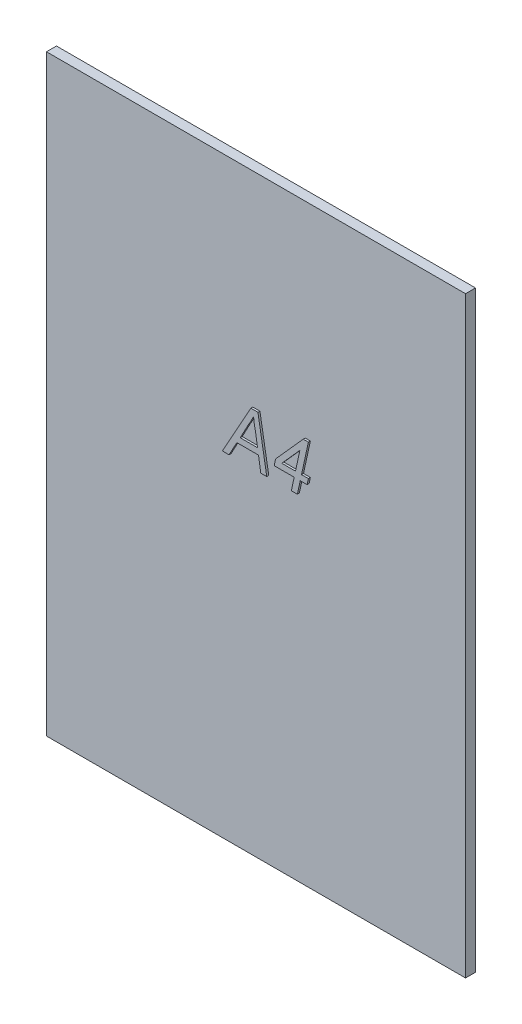
ISO-10303-21;
HEADER;
FILE_DESCRIPTION(('STEP AP214'),'2;1');
FILE_NAME('part.step','',(''),(''),'','','');
FILE_SCHEMA(('AUTOMOTIVE_DESIGN { 1 0 10303 214 1 1 1 1 }'));
ENDSEC;
DATA;
#1=APPLICATION_CONTEXT('core data for automotive mechanical design processes');
#2=APPLICATION_PROTOCOL_DEFINITION('international standard','automotive_design',2000,#1);
#3=PRODUCT_CONTEXT('',#1,'mechanical');
#4=PRODUCT('Part','Part','',(#3));
#5=PRODUCT_RELATED_PRODUCT_CATEGORY('part','',(#4));
#6=PRODUCT_DEFINITION_FORMATION('','',#4);
#7=PRODUCT_DEFINITION_CONTEXT('part definition',#1,'design');
#8=PRODUCT_DEFINITION('design','',#6,#7);
#9=PRODUCT_DEFINITION_SHAPE('','',#8);
#10=(LENGTH_UNIT() NAMED_UNIT(*) SI_UNIT(.MILLI.,.METRE.));
#11=(NAMED_UNIT(*) PLANE_ANGLE_UNIT() SI_UNIT($,.RADIAN.));
#12=(NAMED_UNIT(*) SI_UNIT($,.STERADIAN.) SOLID_ANGLE_UNIT());
#13=UNCERTAINTY_MEASURE_WITH_UNIT(LENGTH_MEASURE(1.E-05),#10,'distance_accuracy_value','');
#14=(GEOMETRIC_REPRESENTATION_CONTEXT(3) GLOBAL_UNCERTAINTY_ASSIGNED_CONTEXT((#13)) GLOBAL_UNIT_ASSIGNED_CONTEXT((#10,
#11,#12)) REPRESENTATION_CONTEXT('',''));
#15=CARTESIAN_POINT('',(0.,0.,0.));
#16=DIRECTION('',(0.,0.,1.));
#17=DIRECTION('',(1.,0.,0.));
#18=AXIS2_PLACEMENT_3D('',#15,#16,#17);
#19=CARTESIAN_POINT('',(0.,0.,3.5));
#20=DIRECTION('',(0.,0.,-1.));
#21=DIRECTION('',(-1.,0.,0.));
#22=AXIS2_PLACEMENT_3D('',#19,#20,#21);
#23=PLANE('',#22);
#24=DIRECTION('',(-1.,0.,0.));
#25=VECTOR('',#24,1.);
#26=CARTESIAN_POINT('',(21.7241162808252,20.3217621400878,3.5));
#27=LINE('',#26,#25);
#28=CARTESIAN_POINT('',(21.7241162808252,20.3217621400878,3.5));
#29=VERTEX_POINT('',#28);
#30=CARTESIAN_POINT('',(18.704078083642,20.3217621400878,3.5));
#31=VERTEX_POINT('',#30);
#32=EDGE_CURVE('E175',#29,#31,#27,.T.);
#33=ORIENTED_EDGE('',*,*,#32,.F.);
#34=DIRECTION('',(-0.212968350352364,-0.977059098390774,0.));
#35=VECTOR('',#34,1.);
#36=CARTESIAN_POINT('',(23.1595347765903,26.9071946654617,3.5));
#37=LINE('',#36,#35);
#38=CARTESIAN_POINT('',(23.1595347765903,26.9071946654617,3.5));
#39=VERTEX_POINT('',#38);
#40=EDGE_CURVE('E206',#39,#29,#37,.T.);
#41=ORIENTED_EDGE('',*,*,#40,.F.);
#42=DIRECTION('',(-1.,0.,0.));
#43=VECTOR('',#42,1.);
#44=CARTESIAN_POINT('',(26.6065971140907,26.9071946654617,3.5));
#45=LINE('',#44,#43);
#46=CARTESIAN_POINT('',(26.6065971140907,26.9071946654617,3.5));
#47=VERTEX_POINT('',#46);
#48=EDGE_CURVE('E203',#47,#39,#45,.T.);
#49=ORIENTED_EDGE('',*,*,#48,.F.);
#50=DIRECTION('',(-0.216930457818656,-0.976187060183953,0.));
#51=VECTOR('',#50,1.);
#52=CARTESIAN_POINT('',(27.2651403666281,29.87063930188,3.5));
#53=LINE('',#52,#51);
#54=CARTESIAN_POINT('',(27.2651403666281,29.87063930188,3.5));
#55=VERTEX_POINT('',#54);
#56=EDGE_CURVE('E200',#55,#47,#53,.T.);
#57=ORIENTED_EDGE('',*,*,#56,.F.);
#58=DIRECTION('',(1.,0.,0.));
#59=VECTOR('',#58,1.);
#60=CARTESIAN_POINT('',(23.8026434216464,29.87063930188,3.5));
#61=LINE('',#60,#59);
#62=CARTESIAN_POINT('',(23.8026434216464,29.87063930188,3.5));
#63=VERTEX_POINT('',#62);
#64=EDGE_CURVE('E197',#63,#55,#61,.T.);
#65=ORIENTED_EDGE('',*,*,#64,.F.);
#66=DIRECTION('',(-0.212786162671667,-0.977098791819674,0.));
#67=VECTOR('',#66,1.);
#68=CARTESIAN_POINT('',(27.2445608899863,45.6756773627774,3.5));
#69=LINE('',#68,#67);
#70=CARTESIAN_POINT('',(27.2445608899863,45.6756773627774,3.5));
#71=VERTEX_POINT('',#70);
#72=EDGE_CURVE('E194',#71,#63,#69,.T.);
#73=ORIENTED_EDGE('',*,*,#72,.F.);
#74=DIRECTION('',(1.,0.,0.));
#75=VECTOR('',#74,1.);
#76=CARTESIAN_POINT('',(24.6309673564786,45.6756773627774,3.5));
#77=LINE('',#76,#75);
#78=CARTESIAN_POINT('',(24.6309673564786,45.6756773627774,3.5));
#79=VERTEX_POINT('',#78);
#80=EDGE_CURVE('E191',#79,#71,#77,.T.);
#81=ORIENTED_EDGE('',*,*,#80,.F.);
#82=DIRECTION('',(0.666084707098258,0.745876104302737,0.));
#83=VECTOR('',#82,1.);
#84=CARTESIAN_POINT('',(10.8015590531933,30.1896211898278,3.5));
#85=LINE('',#84,#83);
#86=CARTESIAN_POINT('',(10.8015590531933,30.1896211898278,3.5));
#87=VERTEX_POINT('',#86);
#88=EDGE_CURVE('E188',#87,#79,#85,.T.);
#89=ORIENTED_EDGE('',*,*,#88,.F.);
#90=DIRECTION('',(0.196707166717952,0.980462284109795,0.));
#91=VECTOR('',#90,1.);
#92=CARTESIAN_POINT('',(10.1430158006559,26.9071946654617,3.5));
#93=LINE('',#92,#91);
#94=CARTESIAN_POINT('',(10.1430158006559,26.9071946654617,3.5));
#95=VERTEX_POINT('',#94);
#96=EDGE_CURVE('E185',#95,#87,#93,.T.);
#97=ORIENTED_EDGE('',*,*,#96,.F.);
#98=DIRECTION('',(-1.,0.,0.));
#99=VECTOR('',#98,1.);
#100=CARTESIAN_POINT('',(20.1394965794071,26.9071946654617,3.5));
#101=LINE('',#100,#99);
#102=CARTESIAN_POINT('',(20.1394965794071,26.9071946654617,3.5));
#103=VERTEX_POINT('',#102);
#104=EDGE_CURVE('E182',#103,#95,#101,.T.);
#105=ORIENTED_EDGE('',*,*,#104,.F.);
#106=DIRECTION('',(0.212968350352364,0.977059098390774,0.));
#107=VECTOR('',#106,1.);
#108=CARTESIAN_POINT('',(18.704078083642,20.3217621400878,3.5));
#109=LINE('',#108,#107);
#110=EDGE_CURVE('E178',#31,#103,#109,.T.);
#111=ORIENTED_EDGE('',*,*,#110,.F.);
#112=EDGE_LOOP('',(#33,#41,#49,#57,#65,#73,#81,#89,#97,#105,#111));
#113=FACE_BOUND('',#112,.T.);
#114=DIRECTION('',(1.,0.,0.));
#115=VECTOR('',#114,1.);
#116=CARTESIAN_POINT('',(13.9296395027459,29.87063930188,3.5));
#117=LINE('',#116,#115);
#118=CARTESIAN_POINT('',(13.9296395027459,29.87063930188,3.5));
#119=VERTEX_POINT('',#118);
#120=CARTESIAN_POINT('',(20.7826052244632,29.87063930188,3.5));
#121=VERTEX_POINT('',#120);
#122=EDGE_CURVE('E148',#119,#121,#117,.T.);
#123=ORIENTED_EDGE('',*,*,#122,.F.);
#124=DIRECTION('',(-0.666075898555017,-0.74588397044321,0.));
#125=VECTOR('',#124,1.);
#126=CARTESIAN_POINT('',(22.9897540942955,40.0163212862842,3.5));
#127=LINE('',#126,#125);
#128=CARTESIAN_POINT('',(22.9897540942955,40.0163212862842,3.5));
#129=VERTEX_POINT('',#128);
#130=EDGE_CURVE('E165',#129,#119,#127,.T.);
#131=ORIENTED_EDGE('',*,*,#130,.F.);
#132=DIRECTION('',(0.212573643929084,0.977145048550475,0.));
#133=VECTOR('',#132,1.);
#134=CARTESIAN_POINT('',(20.7826052244632,29.87063930188,3.5));
#135=LINE('',#134,#133);
#136=EDGE_CURVE('E156',#121,#129,#135,.T.);
#137=ORIENTED_EDGE('',*,*,#136,.F.);
#138=EDGE_LOOP('',(#123,#131,#137));
#139=FACE_BOUND('',#138,.T.);
#140=ADVANCED_FACE('F46',(#113,#139),#23,.F.);
#141=CARTESIAN_POINT('',(0.,0.,2.5));
#142=DIRECTION('',(0.,0.,-1.));
#143=DIRECTION('',(-1.,0.,0.));
#144=AXIS2_PLACEMENT_3D('',#141,#142,#143);
#145=PLANE('',#144);
#146=DIRECTION('',(-1.,0.,0.));
#147=VECTOR('',#146,1.);
#148=CARTESIAN_POINT('',(21.7241162808252,20.3217621400878,2.5));
#149=LINE('',#148,#147);
#150=CARTESIAN_POINT('',(21.7241162808252,20.3217621400878,2.5));
#151=VERTEX_POINT('',#150);
#152=CARTESIAN_POINT('',(18.704078083642,20.3217621400878,2.5));
#153=VERTEX_POINT('',#152);
#154=EDGE_CURVE('E163',#151,#153,#149,.T.);
#155=ORIENTED_EDGE('',*,*,#154,.T.);
#156=DIRECTION('',(0.212968350352364,0.977059098390774,0.));
#157=VECTOR('',#156,1.);
#158=CARTESIAN_POINT('',(18.704078083642,20.3217621400878,2.5));
#159=LINE('',#158,#157);
#160=CARTESIAN_POINT('',(20.1394965794071,26.9071946654617,2.5));
#161=VERTEX_POINT('',#160);
#162=EDGE_CURVE('E211',#153,#161,#159,.T.);
#163=ORIENTED_EDGE('',*,*,#162,.T.);
#164=DIRECTION('',(-1.,0.,0.));
#165=VECTOR('',#164,1.);
#166=CARTESIAN_POINT('',(20.1394965794071,26.9071946654617,2.5));
#167=LINE('',#166,#165);
#168=CARTESIAN_POINT('',(10.1430158006559,26.9071946654617,2.5));
#169=VERTEX_POINT('',#168);
#170=EDGE_CURVE('E214',#161,#169,#167,.T.);
#171=ORIENTED_EDGE('',*,*,#170,.T.);
#172=DIRECTION('',(0.196707166717952,0.980462284109795,0.));
#173=VECTOR('',#172,1.);
#174=CARTESIAN_POINT('',(10.1430158006559,26.9071946654617,2.5));
#175=LINE('',#174,#173);
#176=CARTESIAN_POINT('',(10.8015590531933,30.1896211898278,2.5));
#177=VERTEX_POINT('',#176);
#178=EDGE_CURVE('E217',#169,#177,#175,.T.);
#179=ORIENTED_EDGE('',*,*,#178,.T.);
#180=DIRECTION('',(0.666084707098258,0.745876104302737,0.));
#181=VECTOR('',#180,1.);
#182=CARTESIAN_POINT('',(10.8015590531933,30.1896211898278,2.5));
#183=LINE('',#182,#181);
#184=CARTESIAN_POINT('',(24.6309673564786,45.6756773627774,2.5));
#185=VERTEX_POINT('',#184);
#186=EDGE_CURVE('E220',#177,#185,#183,.T.);
#187=ORIENTED_EDGE('',*,*,#186,.T.);
#188=DIRECTION('',(1.,0.,0.));
#189=VECTOR('',#188,1.);
#190=CARTESIAN_POINT('',(24.6309673564786,45.6756773627774,2.5));
#191=LINE('',#190,#189);
#192=CARTESIAN_POINT('',(27.2445608899863,45.6756773627774,2.5));
#193=VERTEX_POINT('',#192);
#194=EDGE_CURVE('E223',#185,#193,#191,.T.);
#195=ORIENTED_EDGE('',*,*,#194,.T.);
#196=DIRECTION('',(-0.212786162671667,-0.977098791819674,0.));
#197=VECTOR('',#196,1.);
#198=CARTESIAN_POINT('',(27.2445608899863,45.6756773627774,2.5));
#199=LINE('',#198,#197);
#200=CARTESIAN_POINT('',(23.8026434216464,29.87063930188,2.5));
#201=VERTEX_POINT('',#200);
#202=EDGE_CURVE('E226',#193,#201,#199,.T.);
#203=ORIENTED_EDGE('',*,*,#202,.T.);
#204=DIRECTION('',(1.,0.,0.));
#205=VECTOR('',#204,1.);
#206=CARTESIAN_POINT('',(23.8026434216464,29.87063930188,2.5));
#207=LINE('',#206,#205);
#208=CARTESIAN_POINT('',(27.2651403666281,29.87063930188,2.5));
#209=VERTEX_POINT('',#208);
#210=EDGE_CURVE('E229',#201,#209,#207,.T.);
#211=ORIENTED_EDGE('',*,*,#210,.T.);
#212=DIRECTION('',(-0.216930457818656,-0.976187060183953,0.));
#213=VECTOR('',#212,1.);
#214=CARTESIAN_POINT('',(27.2651403666281,29.87063930188,2.5));
#215=LINE('',#214,#213);
#216=CARTESIAN_POINT('',(26.6065971140907,26.9071946654617,2.5));
#217=VERTEX_POINT('',#216);
#218=EDGE_CURVE('E232',#209,#217,#215,.T.);
#219=ORIENTED_EDGE('',*,*,#218,.T.);
#220=DIRECTION('',(-1.,0.,0.));
#221=VECTOR('',#220,1.);
#222=CARTESIAN_POINT('',(26.6065971140907,26.9071946654617,2.5));
#223=LINE('',#222,#221);
#224=CARTESIAN_POINT('',(23.1595347765903,26.9071946654617,2.5));
#225=VERTEX_POINT('',#224);
#226=EDGE_CURVE('E235',#217,#225,#223,.T.);
#227=ORIENTED_EDGE('',*,*,#226,.T.);
#228=DIRECTION('',(-0.212968350352364,-0.977059098390774,0.));
#229=VECTOR('',#228,1.);
#230=CARTESIAN_POINT('',(23.1595347765903,26.9071946654617,2.5));
#231=LINE('',#230,#229);
#232=EDGE_CURVE('E179',#225,#151,#231,.T.);
#233=ORIENTED_EDGE('',*,*,#232,.T.);
#234=EDGE_LOOP('',(#155,#163,#171,#179,#187,#195,#203,#211,#219,#227,#233));
#235=FACE_BOUND('',#234,.T.);
#236=DIRECTION('',(-0.666075898555017,-0.74588397044321,0.));
#237=VECTOR('',#236,1.);
#238=CARTESIAN_POINT('',(22.9897540942955,40.0163212862842,2.5));
#239=LINE('',#238,#237);
#240=CARTESIAN_POINT('',(22.9897540942955,40.0163212862842,2.5));
#241=VERTEX_POINT('',#240);
#242=CARTESIAN_POINT('',(13.9296395027459,29.87063930188,2.5));
#243=VERTEX_POINT('',#242);
#244=EDGE_CURVE('E157',#241,#243,#239,.T.);
#245=ORIENTED_EDGE('',*,*,#244,.T.);
#246=DIRECTION('',(1.,0.,0.));
#247=VECTOR('',#246,1.);
#248=CARTESIAN_POINT('',(13.9296395027459,29.87063930188,2.5));
#249=LINE('',#248,#247);
#250=CARTESIAN_POINT('',(20.7826052244632,29.87063930188,2.5));
#251=VERTEX_POINT('',#250);
#252=EDGE_CURVE('E71',#243,#251,#249,.T.);
#253=ORIENTED_EDGE('',*,*,#252,.T.);
#254=DIRECTION('',(0.212573643929084,0.977145048550475,0.));
#255=VECTOR('',#254,1.);
#256=CARTESIAN_POINT('',(20.7826052244632,29.87063930188,2.5));
#257=LINE('',#256,#255);
#258=EDGE_CURVE('E162',#251,#241,#257,.T.);
#259=ORIENTED_EDGE('',*,*,#258,.T.);
#260=EDGE_LOOP('',(#245,#253,#259));
#261=FACE_BOUND('',#260,.T.);
#262=ADVANCED_FACE('F264',(#235,#261),#145,.T.);
#263=CARTESIAN_POINT('',(21.7241162808252,20.3217621400878,3.5));
#264=DIRECTION('',(0.,-1.,0.));
#265=DIRECTION('',(0.,0.,-1.));
#266=AXIS2_PLACEMENT_3D('',#263,#264,#265);
#267=PLANE('',#266);
#268=ORIENTED_EDGE('',*,*,#154,.F.);
#269=DIRECTION('',(0.,0.,-1.));
#270=VECTOR('',#269,1.);
#271=CARTESIAN_POINT('',(21.7241162808252,20.3217621400878,3.5));
#272=LINE('',#271,#270);
#273=EDGE_CURVE('E12',#29,#151,#272,.T.);
#274=ORIENTED_EDGE('',*,*,#273,.F.);
#275=ORIENTED_EDGE('',*,*,#32,.T.);
#276=DIRECTION('',(0.,0.,-1.));
#277=VECTOR('',#276,1.);
#278=CARTESIAN_POINT('',(18.704078083642,20.3217621400878,3.5));
#279=LINE('',#278,#277);
#280=EDGE_CURVE('E50',#31,#153,#279,.T.);
#281=ORIENTED_EDGE('',*,*,#280,.T.);
#282=EDGE_LOOP('',(#268,#274,#275,#281));
#283=FACE_BOUND('',#282,.T.);
#284=ADVANCED_FACE('F48',(#283),#267,.T.);
#285=CARTESIAN_POINT('',(23.1595347765903,26.9071946654617,3.5));
#286=DIRECTION('',(0.977059098390774,-0.212968350352364,0.));
#287=DIRECTION('',(0.212968350352364,0.977059098390774,0.));
#288=AXIS2_PLACEMENT_3D('',#285,#286,#287);
#289=PLANE('',#288);
#290=ORIENTED_EDGE('',*,*,#232,.F.);
#291=DIRECTION('',(0.,0.,-1.));
#292=VECTOR('',#291,1.);
#293=CARTESIAN_POINT('',(23.1595347765903,26.9071946654617,3.5));
#294=LINE('',#293,#292);
#295=EDGE_CURVE('E55',#39,#225,#294,.T.);
#296=ORIENTED_EDGE('',*,*,#295,.F.);
#297=ORIENTED_EDGE('',*,*,#40,.T.);
#298=ORIENTED_EDGE('',*,*,#273,.T.);
#299=EDGE_LOOP('',(#290,#296,#297,#298));
#300=FACE_BOUND('',#299,.T.);
#301=ADVANCED_FACE('F269',(#300),#289,.T.);
#302=CARTESIAN_POINT('',(26.6065971140907,26.9071946654617,3.5));
#303=DIRECTION('',(0.,-1.,0.));
#304=DIRECTION('',(0.,0.,-1.));
#305=AXIS2_PLACEMENT_3D('',#302,#303,#304);
#306=PLANE('',#305);
#307=ORIENTED_EDGE('',*,*,#226,.F.);
#308=DIRECTION('',(0.,0.,-1.));
#309=VECTOR('',#308,1.);
#310=CARTESIAN_POINT('',(26.6065971140907,26.9071946654617,3.5));
#311=LINE('',#310,#309);
#312=EDGE_CURVE('E241',#47,#217,#311,.T.);
#313=ORIENTED_EDGE('',*,*,#312,.F.);
#314=ORIENTED_EDGE('',*,*,#48,.T.);
#315=ORIENTED_EDGE('',*,*,#295,.T.);
#316=EDGE_LOOP('',(#307,#313,#314,#315));
#317=FACE_BOUND('',#316,.T.);
#318=ADVANCED_FACE('F301',(#317),#306,.T.);
#319=CARTESIAN_POINT('',(27.2651403666281,29.87063930188,3.5));
#320=DIRECTION('',(0.976187060183953,-0.216930457818656,0.));
#321=DIRECTION('',(0.216930457818656,0.976187060183953,0.));
#322=AXIS2_PLACEMENT_3D('',#319,#320,#321);
#323=PLANE('',#322);
#324=ORIENTED_EDGE('',*,*,#218,.F.);
#325=DIRECTION('',(0.,0.,-1.));
#326=VECTOR('',#325,1.);
#327=CARTESIAN_POINT('',(27.2651403666281,29.87063930188,3.5));
#328=LINE('',#327,#326);
#329=EDGE_CURVE('E243',#55,#209,#328,.T.);
#330=ORIENTED_EDGE('',*,*,#329,.F.);
#331=ORIENTED_EDGE('',*,*,#56,.T.);
#332=ORIENTED_EDGE('',*,*,#312,.T.);
#333=EDGE_LOOP('',(#324,#330,#331,#332));
#334=FACE_BOUND('',#333,.T.);
#335=ADVANCED_FACE('F299',(#334),#323,.T.);
#336=CARTESIAN_POINT('',(23.8026434216464,29.87063930188,3.5));
#337=DIRECTION('',(0.,1.,0.));
#338=DIRECTION('',(0.,0.,1.));
#339=AXIS2_PLACEMENT_3D('',#336,#337,#338);
#340=PLANE('',#339);
#341=ORIENTED_EDGE('',*,*,#210,.F.);
#342=DIRECTION('',(0.,0.,-1.));
#343=VECTOR('',#342,1.);
#344=CARTESIAN_POINT('',(23.8026434216464,29.87063930188,3.5));
#345=LINE('',#344,#343);
#346=EDGE_CURVE('E245',#63,#201,#345,.T.);
#347=ORIENTED_EDGE('',*,*,#346,.F.);
#348=ORIENTED_EDGE('',*,*,#64,.T.);
#349=ORIENTED_EDGE('',*,*,#329,.T.);
#350=EDGE_LOOP('',(#341,#347,#348,#349));
#351=FACE_BOUND('',#350,.T.);
#352=ADVANCED_FACE('F295',(#351),#340,.T.);
#353=CARTESIAN_POINT('',(27.2445608899863,45.6756773627774,3.5));
#354=DIRECTION('',(0.977098791819674,-0.212786162671667,0.));
#355=DIRECTION('',(0.212786162671667,0.977098791819674,0.));
#356=AXIS2_PLACEMENT_3D('',#353,#354,#355);
#357=PLANE('',#356);
#358=ORIENTED_EDGE('',*,*,#202,.F.);
#359=DIRECTION('',(0.,0.,-1.));
#360=VECTOR('',#359,1.);
#361=CARTESIAN_POINT('',(27.2445608899863,45.6756773627774,3.5));
#362=LINE('',#361,#360);
#363=EDGE_CURVE('E247',#71,#193,#362,.T.);
#364=ORIENTED_EDGE('',*,*,#363,.F.);
#365=ORIENTED_EDGE('',*,*,#72,.T.);
#366=ORIENTED_EDGE('',*,*,#346,.T.);
#367=EDGE_LOOP('',(#358,#364,#365,#366));
#368=FACE_BOUND('',#367,.T.);
#369=ADVANCED_FACE('F291',(#368),#357,.T.);
#370=CARTESIAN_POINT('',(24.6309673564786,45.6756773627774,3.5));
#371=DIRECTION('',(0.,1.,0.));
#372=DIRECTION('',(0.,0.,1.));
#373=AXIS2_PLACEMENT_3D('',#370,#371,#372);
#374=PLANE('',#373);
#375=ORIENTED_EDGE('',*,*,#194,.F.);
#376=DIRECTION('',(0.,0.,-1.));
#377=VECTOR('',#376,1.);
#378=CARTESIAN_POINT('',(24.6309673564786,45.6756773627774,3.5));
#379=LINE('',#378,#377);
#380=EDGE_CURVE('E249',#79,#185,#379,.T.);
#381=ORIENTED_EDGE('',*,*,#380,.F.);
#382=ORIENTED_EDGE('',*,*,#80,.T.);
#383=ORIENTED_EDGE('',*,*,#363,.T.);
#384=EDGE_LOOP('',(#375,#381,#382,#383));
#385=FACE_BOUND('',#384,.T.);
#386=ADVANCED_FACE('F287',(#385),#374,.T.);
#387=CARTESIAN_POINT('',(10.8015590531933,30.1896211898278,3.5));
#388=DIRECTION('',(-0.745876104302737,0.666084707098258,0.));
#389=DIRECTION('',(-0.666084707098258,-0.745876104302737,0.));
#390=AXIS2_PLACEMENT_3D('',#387,#388,#389);
#391=PLANE('',#390);
#392=ORIENTED_EDGE('',*,*,#186,.F.);
#393=DIRECTION('',(0.,0.,-1.));
#394=VECTOR('',#393,1.);
#395=CARTESIAN_POINT('',(10.8015590531933,30.1896211898278,3.5));
#396=LINE('',#395,#394);
#397=EDGE_CURVE('E251',#87,#177,#396,.T.);
#398=ORIENTED_EDGE('',*,*,#397,.F.);
#399=ORIENTED_EDGE('',*,*,#88,.T.);
#400=ORIENTED_EDGE('',*,*,#380,.T.);
#401=EDGE_LOOP('',(#392,#398,#399,#400));
#402=FACE_BOUND('',#401,.T.);
#403=ADVANCED_FACE('F283',(#402),#391,.T.);
#404=CARTESIAN_POINT('',(10.1430158006559,26.9071946654617,3.5));
#405=DIRECTION('',(-0.980462284109795,0.196707166717952,0.));
#406=DIRECTION('',(-0.196707166717952,-0.980462284109795,0.));
#407=AXIS2_PLACEMENT_3D('',#404,#405,#406);
#408=PLANE('',#407);
#409=ORIENTED_EDGE('',*,*,#178,.F.);
#410=DIRECTION('',(0.,0.,-1.));
#411=VECTOR('',#410,1.);
#412=CARTESIAN_POINT('',(10.1430158006559,26.9071946654617,3.5));
#413=LINE('',#412,#411);
#414=EDGE_CURVE('E253',#95,#169,#413,.T.);
#415=ORIENTED_EDGE('',*,*,#414,.F.);
#416=ORIENTED_EDGE('',*,*,#96,.T.);
#417=ORIENTED_EDGE('',*,*,#397,.T.);
#418=EDGE_LOOP('',(#409,#415,#416,#417));
#419=FACE_BOUND('',#418,.T.);
#420=ADVANCED_FACE('F281',(#419),#408,.T.);
#421=CARTESIAN_POINT('',(20.1394965794071,26.9071946654617,3.5));
#422=DIRECTION('',(0.,-1.,0.));
#423=DIRECTION('',(0.,0.,-1.));
#424=AXIS2_PLACEMENT_3D('',#421,#422,#423);
#425=PLANE('',#424);
#426=ORIENTED_EDGE('',*,*,#170,.F.);
#427=DIRECTION('',(0.,0.,-1.));
#428=VECTOR('',#427,1.);
#429=CARTESIAN_POINT('',(20.1394965794071,26.9071946654617,3.5));
#430=LINE('',#429,#428);
#431=EDGE_CURVE('E254',#103,#161,#430,.T.);
#432=ORIENTED_EDGE('',*,*,#431,.F.);
#433=ORIENTED_EDGE('',*,*,#104,.T.);
#434=ORIENTED_EDGE('',*,*,#414,.T.);
#435=EDGE_LOOP('',(#426,#432,#433,#434));
#436=FACE_BOUND('',#435,.T.);
#437=ADVANCED_FACE('F277',(#436),#425,.T.);
#438=CARTESIAN_POINT('',(18.704078083642,20.3217621400878,3.5));
#439=DIRECTION('',(-0.977059098390774,0.212968350352364,0.));
#440=DIRECTION('',(-0.212968350352364,-0.977059098390774,0.));
#441=AXIS2_PLACEMENT_3D('',#438,#439,#440);
#442=PLANE('',#441);
#443=ORIENTED_EDGE('',*,*,#162,.F.);
#444=ORIENTED_EDGE('',*,*,#280,.F.);
#445=ORIENTED_EDGE('',*,*,#110,.T.);
#446=ORIENTED_EDGE('',*,*,#431,.T.);
#447=EDGE_LOOP('',(#443,#444,#445,#446));
#448=FACE_BOUND('',#447,.T.);
#449=ADVANCED_FACE('F262',(#448),#442,.T.);
#450=CARTESIAN_POINT('',(13.9296395027459,29.87063930188,3.5));
#451=DIRECTION('',(0.,1.,0.));
#452=DIRECTION('',(0.,0.,1.));
#453=AXIS2_PLACEMENT_3D('',#450,#451,#452);
#454=PLANE('',#453);
#455=ORIENTED_EDGE('',*,*,#252,.F.);
#456=DIRECTION('',(0.,0.,-1.));
#457=VECTOR('',#456,1.);
#458=CARTESIAN_POINT('',(13.9296395027459,29.87063930188,3.5));
#459=LINE('',#458,#457);
#460=EDGE_CURVE('E152',#119,#243,#459,.T.);
#461=ORIENTED_EDGE('',*,*,#460,.F.);
#462=ORIENTED_EDGE('',*,*,#122,.T.);
#463=DIRECTION('',(0.,0.,-1.));
#464=VECTOR('',#463,1.);
#465=CARTESIAN_POINT('',(20.7826052244632,29.87063930188,3.5));
#466=LINE('',#465,#464);
#467=EDGE_CURVE('E151',#121,#251,#466,.T.);
#468=ORIENTED_EDGE('',*,*,#467,.T.);
#469=EDGE_LOOP('',(#455,#461,#462,#468));
#470=FACE_BOUND('',#469,.T.);
#471=ADVANCED_FACE('F150',(#470),#454,.T.);
#472=CARTESIAN_POINT('',(20.7826052244632,29.87063930188,3.5));
#473=DIRECTION('',(-0.977145048550475,0.212573643929084,0.));
#474=DIRECTION('',(-0.212573643929084,-0.977145048550476,0.));
#475=AXIS2_PLACEMENT_3D('',#472,#473,#474);
#476=PLANE('',#475);
#477=ORIENTED_EDGE('',*,*,#258,.F.);
#478=ORIENTED_EDGE('',*,*,#467,.F.);
#479=ORIENTED_EDGE('',*,*,#136,.T.);
#480=DIRECTION('',(0.,0.,-1.));
#481=VECTOR('',#480,1.);
#482=CARTESIAN_POINT('',(22.9897540942955,40.0163212862842,3.5));
#483=LINE('',#482,#481);
#484=EDGE_CURVE('E63',#129,#241,#483,.T.);
#485=ORIENTED_EDGE('',*,*,#484,.T.);
#486=EDGE_LOOP('',(#477,#478,#479,#485));
#487=FACE_BOUND('',#486,.T.);
#488=ADVANCED_FACE('F160',(#487),#476,.T.);
#489=CARTESIAN_POINT('',(22.9897540942955,40.0163212862842,3.5));
#490=DIRECTION('',(0.74588397044321,-0.666075898555017,0.));
#491=DIRECTION('',(0.666075898555017,0.74588397044321,0.));
#492=AXIS2_PLACEMENT_3D('',#489,#490,#491);
#493=PLANE('',#492);
#494=ORIENTED_EDGE('',*,*,#244,.F.);
#495=ORIENTED_EDGE('',*,*,#484,.F.);
#496=ORIENTED_EDGE('',*,*,#130,.T.);
#497=ORIENTED_EDGE('',*,*,#460,.T.);
#498=EDGE_LOOP('',(#494,#495,#496,#497));
#499=FACE_BOUND('',#498,.T.);
#500=ADVANCED_FACE('F321',(#499),#493,.T.);
#501=CLOSED_SHELL('',(#140,#262,#284,#301,#318,#335,#352,#369,#386,#403,#420,#437,#449,#471,
#488,#500));
#502=MANIFOLD_SOLID_BREP('B2',#501);
#503=CARTESIAN_POINT('',(0.,0.,3.5));
#504=DIRECTION('',(0.,0.,-1.));
#505=DIRECTION('',(-1.,0.,0.));
#506=AXIS2_PLACEMENT_3D('',#503,#504,#505);
#507=PLANE('',#506);
#508=DIRECTION('',(-1.,0.,0.));
#509=VECTOR('',#508,1.);
#510=CARTESIAN_POINT('',(-12.5149879819588,20.3217621400878,3.5));
#511=LINE('',#510,#509);
#512=CARTESIAN_POINT('',(-12.5149879819588,20.3217621400878,3.5));
#513=VERTEX_POINT('',#512);
#514=CARTESIAN_POINT('',(-15.833428590448,20.3217621400878,3.5));
#515=VERTEX_POINT('',#514);
#516=EDGE_CURVE('E660',#513,#515,#511,.T.);
#517=ORIENTED_EDGE('',*,*,#516,.F.);
#518=DIRECTION('',(-0.475477828956271,-0.879727704560355,0.));
#519=VECTOR('',#518,1.);
#520=CARTESIAN_POINT('',(-8.59974255085754,27.5657379179991,3.5));
#521=LINE('',#520,#519);
#522=CARTESIAN_POINT('',(-8.59974255085754,27.5657379179991,3.5));
#523=VERTEX_POINT('',#522);
#524=EDGE_CURVE('E645',#523,#513,#521,.T.);
#525=ORIENTED_EDGE('',*,*,#524,.F.);
#526=DIRECTION('',(-1.,0.,0.));
#527=VECTOR('',#526,1.);
#528=CARTESIAN_POINT('',(2.23535190104675,27.5657379179991,3.5));
#529=LINE('',#528,#527);
#530=CARTESIAN_POINT('',(2.23535190104675,27.5657379179991,3.5));
#531=VERTEX_POINT('',#530);
#532=EDGE_CURVE('E672',#531,#523,#529,.T.);
#533=ORIENTED_EDGE('',*,*,#532,.F.);
#534=DIRECTION('',(-0.15779902765745,0.987471248629733,0.));
#535=VECTOR('',#534,1.);
#536=CARTESIAN_POINT('',(3.39294746214764,20.3217621400878,3.5));
#537=LINE('',#536,#535);
#538=CARTESIAN_POINT('',(3.39294746214764,20.3217621400878,3.5));
#539=VERTEX_POINT('',#538);
#540=EDGE_CURVE('E675',#539,#531,#537,.T.);
#541=ORIENTED_EDGE('',*,*,#540,.F.);
#542=DIRECTION('',(-1.,0.,0.));
#543=VECTOR('',#542,1.);
#544=CARTESIAN_POINT('',(6.3872613135286,20.3217621400878,3.5));
#545=LINE('',#544,#543);
#546=CARTESIAN_POINT('',(6.3872613135286,20.3217621400878,3.5));
#547=VERTEX_POINT('',#546);
#548=EDGE_CURVE('E678',#547,#539,#545,.T.);
#549=ORIENTED_EDGE('',*,*,#548,.F.);
#550=DIRECTION('',(0.169966411485713,-0.985449856140163,0.));
#551=VECTOR('',#550,1.);
#552=CARTESIAN_POINT('',(1.95752896638254,46.0049489890461,3.5));
#553=LINE('',#552,#551);
#554=CARTESIAN_POINT('',(1.95752896638254,46.0049489890461,3.5));
#555=VERTEX_POINT('',#554);
#556=EDGE_CURVE('E683',#555,#547,#553,.T.);
#557=ORIENTED_EDGE('',*,*,#556,.F.);
#558=DIRECTION('',(1.,0.,0.));
#559=VECTOR('',#558,1.);
#560=CARTESIAN_POINT('',(-1.5769961468455,46.0049489890461,3.5));
#561=LINE('',#560,#559);
#562=CARTESIAN_POINT('',(-1.5769961468455,46.0049489890461,3.5));
#563=VERTEX_POINT('',#562);
#564=EDGE_CURVE('E686',#563,#555,#561,.T.);
#565=ORIENTED_EDGE('',*,*,#564,.F.);
#566=DIRECTION('',(0.485330610893607,0.874330714392236,0.));
#567=VECTOR('',#566,1.);
#568=CARTESIAN_POINT('',(-15.833428590448,20.3217621400878,3.5));
#569=LINE('',#568,#567);
#570=EDGE_CURVE('E689',#515,#563,#569,.T.);
#571=ORIENTED_EDGE('',*,*,#570,.F.);
#572=EDGE_LOOP('',(#517,#525,#533,#541,#549,#557,#565,#571));
#573=FACE_BOUND('',#572,.T.);
#574=DIRECTION('',(-0.467293576316189,-0.884102207628522,0.));
#575=VECTOR('',#574,1.);
#576=CARTESIAN_POINT('',(-3.0021249042897,37.9172146688213,3.5));
#577=LINE('',#576,#575);
#578=CARTESIAN_POINT('',(-3.0021249042897,37.9172146688213,3.5));
#579=VERTEX_POINT('',#578);
#580=CARTESIAN_POINT('',(-6.90708059707002,30.5291825544174,3.5));
#581=VERTEX_POINT('',#580);
#582=EDGE_CURVE('E537',#579,#581,#577,.T.);
#583=ORIENTED_EDGE('',*,*,#582,.F.);
#584=CARTESIAN_POINT('',(-0.229040426808021,43.0415043526279,3.5));
#585=CARTESIAN_POINT('',(-0.40249551695455,42.6626698137759,3.5));
#586=CARTESIAN_POINT('',(-0.76821016497078,41.8639308438466,3.5));
#587=CARTESIAN_POINT('',(-1.41336508012876,40.6340687363554,3.5));
#588=CARTESIAN_POINT('',(-2.16421725964078,39.3043209965068,3.5));
#589=CARTESIAN_POINT('',(-2.7149969704582,38.3925379057155,3.5));
#590=CARTESIAN_POINT('',(-3.0021249042897,37.9172146688213,3.5));
#591=B_SPLINE_CURVE_WITH_KNOTS('',3,(#584,#585,#586,#587,#588,#589,#590),.UNSPECIFIED.,.F.,.F.,
(4,1,1,1,4),(0.,0.214349835090603,0.451937584687051,0.714288624237884,1.),.UNSPECIFIED.);
#592=CARTESIAN_POINT('',(-0.229040426808021,43.0415043526279,3.5));
#593=VERTEX_POINT('',#592);
#594=EDGE_CURVE('E567',#593,#579,#591,.T.);
#595=ORIENTED_EDGE('',*,*,#594,.F.);
#596=CARTESIAN_POINT('',(0.779353928639863,36.7133152852763,3.5));
#597=CARTESIAN_POINT('',(0.712533382489502,37.0233943546843,3.5));
#598=CARTESIAN_POINT('',(0.582081342443882,37.628753776451,3.5));
#599=CARTESIAN_POINT('',(0.418647767702179,38.5210859989734,3.5));
#600=CARTESIAN_POINT('',(0.251500228748397,39.3694492861088,3.5));
#601=CARTESIAN_POINT('',(0.124242409457733,40.1806678326617,3.5));
#602=CARTESIAN_POINT('',(-0.00190758735667794,40.9508823527666,3.5));
#603=CARTESIAN_POINT('',(-0.0863572906933458,41.6832904402803,3.5));
#604=CARTESIAN_POINT('',(-0.176984948398209,42.3747447340035,3.5));
#605=CARTESIAN_POINT('',(-0.212021320552194,42.8235128339038,3.5));
#606=CARTESIAN_POINT('',(-0.229040426808021,43.0415043526279,3.5));
#607=B_SPLINE_CURVE_WITH_KNOTS('',3,(#596,#597,#598,#599,#600,#601,#602,#603,#604,#605,#606),
.UNSPECIFIED.,.F.,.F.,(4,1,1,1,1,1,1,1,4),(0.,0.148384394605271,0.289687051399345,
0.424384743795187,0.552854956211982,0.67381533819845,0.78945133337464,0.897724852516958,1.),.UNSPECIFIED.);
#608=CARTESIAN_POINT('',(0.779353928639863,36.7133152852763,3.5));
#609=VERTEX_POINT('',#608);
#610=EDGE_CURVE('E560',#609,#593,#607,.T.);
#611=ORIENTED_EDGE('',*,*,#610,.F.);
#612=DIRECTION('',(-0.15773416750815,0.987481611170816,0.));
#613=VECTOR('',#612,1.);
#614=CARTESIAN_POINT('',(1.76716880744595,30.5291825544174,3.5));
#615=LINE('',#614,#613);
#616=CARTESIAN_POINT('',(1.76716880744595,30.5291825544174,3.5));
#617=VERTEX_POINT('',#616);
#618=EDGE_CURVE('E558',#617,#609,#615,.T.);
#619=ORIENTED_EDGE('',*,*,#618,.F.);
#620=DIRECTION('',(1.,0.,0.));
#621=VECTOR('',#620,1.);
#622=CARTESIAN_POINT('',(-6.90708059707002,30.5291825544174,3.5));
#623=LINE('',#622,#621);
#624=EDGE_CURVE('E545',#581,#617,#623,.T.);
#625=ORIENTED_EDGE('',*,*,#624,.F.);
#626=EDGE_LOOP('',(#583,#595,#611,#619,#625));
#627=FACE_BOUND('',#626,.T.);
#628=ADVANCED_FACE('F441',(#573,#627),#507,.F.);
#629=CARTESIAN_POINT('',(0.,0.,2.5));
#630=DIRECTION('',(0.,0.,-1.));
#631=DIRECTION('',(-1.,0.,0.));
#632=AXIS2_PLACEMENT_3D('',#629,#630,#631);
#633=PLANE('',#632);
#634=DIRECTION('',(-1.,0.,0.));
#635=VECTOR('',#634,1.);
#636=CARTESIAN_POINT('',(-12.5149879819588,20.3217621400878,2.5));
#637=LINE('',#636,#635);
#638=CARTESIAN_POINT('',(-12.5149879819588,20.3217621400878,2.5));
#639=VERTEX_POINT('',#638);
#640=CARTESIAN_POINT('',(-15.833428590448,20.3217621400878,2.5));
#641=VERTEX_POINT('',#640);
#642=EDGE_CURVE('E553',#639,#641,#637,.T.);
#643=ORIENTED_EDGE('',*,*,#642,.T.);
#644=DIRECTION('',(0.485330610893607,0.874330714392236,0.));
#645=VECTOR('',#644,1.);
#646=CARTESIAN_POINT('',(-15.833428590448,20.3217621400878,2.5));
#647=LINE('',#646,#645);
#648=CARTESIAN_POINT('',(-1.5769961468455,46.0049489890461,2.5));
#649=VERTEX_POINT('',#648);
#650=EDGE_CURVE('E627',#641,#649,#647,.T.);
#651=ORIENTED_EDGE('',*,*,#650,.T.);
#652=DIRECTION('',(1.,0.,0.));
#653=VECTOR('',#652,1.);
#654=CARTESIAN_POINT('',(-1.5769961468455,46.0049489890461,2.5));
#655=LINE('',#654,#653);
#656=CARTESIAN_POINT('',(1.95752896638254,46.0049489890461,2.5));
#657=VERTEX_POINT('',#656);
#658=EDGE_CURVE('E634',#649,#657,#655,.T.);
#659=ORIENTED_EDGE('',*,*,#658,.T.);
#660=DIRECTION('',(0.169966411485713,-0.985449856140163,0.));
#661=VECTOR('',#660,1.);
#662=CARTESIAN_POINT('',(1.95752896638254,46.0049489890461,2.5));
#663=LINE('',#662,#661);
#664=CARTESIAN_POINT('',(6.3872613135286,20.3217621400878,2.5));
#665=VERTEX_POINT('',#664);
#666=EDGE_CURVE('E649',#657,#665,#663,.T.);
#667=ORIENTED_EDGE('',*,*,#666,.T.);
#668=DIRECTION('',(-1.,0.,0.));
#669=VECTOR('',#668,1.);
#670=CARTESIAN_POINT('',(6.3872613135286,20.3217621400878,2.5));
#671=LINE('',#670,#669);
#672=CARTESIAN_POINT('',(3.39294746214764,20.3217621400878,2.5));
#673=VERTEX_POINT('',#672);
#674=EDGE_CURVE('E652',#665,#673,#671,.T.);
#675=ORIENTED_EDGE('',*,*,#674,.T.);
#676=DIRECTION('',(-0.15779902765745,0.987471248629733,0.));
#677=VECTOR('',#676,1.);
#678=CARTESIAN_POINT('',(3.39294746214764,20.3217621400878,2.5));
#679=LINE('',#678,#677);
#680=CARTESIAN_POINT('',(2.23535190104675,27.5657379179991,2.5));
#681=VERTEX_POINT('',#680);
#682=EDGE_CURVE('E655',#673,#681,#679,.T.);
#683=ORIENTED_EDGE('',*,*,#682,.T.);
#684=DIRECTION('',(-1.,0.,0.));
#685=VECTOR('',#684,1.);
#686=CARTESIAN_POINT('',(2.23535190104675,27.5657379179991,2.5));
#687=LINE('',#686,#685);
#688=CARTESIAN_POINT('',(-8.59974255085754,27.5657379179991,2.5));
#689=VERTEX_POINT('',#688);
#690=EDGE_CURVE('E658',#681,#689,#687,.T.);
#691=ORIENTED_EDGE('',*,*,#690,.T.);
#692=DIRECTION('',(-0.475477828956271,-0.879727704560355,0.));
#693=VECTOR('',#692,1.);
#694=CARTESIAN_POINT('',(-8.59974255085754,27.5657379179991,2.5));
#695=LINE('',#694,#693);
#696=EDGE_CURVE('E641',#689,#639,#695,.T.);
#697=ORIENTED_EDGE('',*,*,#696,.T.);
#698=EDGE_LOOP('',(#643,#651,#659,#667,#675,#683,#691,#697));
#699=FACE_BOUND('',#698,.T.);
#700=CARTESIAN_POINT('',(-0.229040426808021,43.0415043526279,2.5));
#701=CARTESIAN_POINT('',(-0.40249551695455,42.6626698137759,2.5));
#702=CARTESIAN_POINT('',(-0.76821016497078,41.8639308438466,2.5));
#703=CARTESIAN_POINT('',(-1.41336508012876,40.6340687363554,2.5));
#704=CARTESIAN_POINT('',(-2.16421725964078,39.3043209965068,2.5));
#705=CARTESIAN_POINT('',(-2.7149969704582,38.3925379057155,2.5));
#706=CARTESIAN_POINT('',(-3.0021249042897,37.9172146688213,2.5));
#707=B_SPLINE_CURVE_WITH_KNOTS('',3,(#700,#701,#702,#703,#704,#705,#706),.UNSPECIFIED.,.F.,.F.,
(4,1,1,1,4),(0.,0.214349835090603,0.451937584687051,0.714288624237884,1.),.UNSPECIFIED.);
#708=CARTESIAN_POINT('',(-0.229040426808021,43.0415043526279,2.5));
#709=VERTEX_POINT('',#708);
#710=CARTESIAN_POINT('',(-3.0021249042897,37.9172146688213,2.5));
#711=VERTEX_POINT('',#710);
#712=EDGE_CURVE('E546',#709,#711,#707,.T.);
#713=ORIENTED_EDGE('',*,*,#712,.T.);
#714=DIRECTION('',(-0.467293576316189,-0.884102207628522,0.));
#715=VECTOR('',#714,1.);
#716=CARTESIAN_POINT('',(-3.0021249042897,37.9172146688213,2.5));
#717=LINE('',#716,#715);
#718=CARTESIAN_POINT('',(-6.90708059707002,30.5291825544174,2.5));
#719=VERTEX_POINT('',#718);
#720=EDGE_CURVE('E466',#711,#719,#717,.T.);
#721=ORIENTED_EDGE('',*,*,#720,.T.);
#722=DIRECTION('',(1.,0.,0.));
#723=VECTOR('',#722,1.);
#724=CARTESIAN_POINT('',(-6.90708059707002,30.5291825544174,2.5));
#725=LINE('',#724,#723);
#726=CARTESIAN_POINT('',(1.76716880744595,30.5291825544174,2.5));
#727=VERTEX_POINT('',#726);
#728=EDGE_CURVE('E552',#719,#727,#725,.T.);
#729=ORIENTED_EDGE('',*,*,#728,.T.);
#730=DIRECTION('',(-0.15773416750815,0.987481611170816,0.));
#731=VECTOR('',#730,1.);
#732=CARTESIAN_POINT('',(1.76716880744595,30.5291825544174,2.5));
#733=LINE('',#732,#731);
#734=CARTESIAN_POINT('',(0.779353928639863,36.7133152852763,2.5));
#735=VERTEX_POINT('',#734);
#736=EDGE_CURVE('E709',#727,#735,#733,.T.);
#737=ORIENTED_EDGE('',*,*,#736,.T.);
#738=CARTESIAN_POINT('',(0.779353928639863,36.7133152852763,2.5));
#739=CARTESIAN_POINT('',(0.712533382489502,37.0233943546843,2.5));
#740=CARTESIAN_POINT('',(0.582081342443882,37.628753776451,2.5));
#741=CARTESIAN_POINT('',(0.418647767702179,38.5210859989734,2.5));
#742=CARTESIAN_POINT('',(0.251500228748397,39.3694492861088,2.5));
#743=CARTESIAN_POINT('',(0.124242409457733,40.1806678326617,2.5));
#744=CARTESIAN_POINT('',(-0.00190758735667794,40.9508823527666,2.5));
#745=CARTESIAN_POINT('',(-0.0863572906933458,41.6832904402803,2.5));
#746=CARTESIAN_POINT('',(-0.176984948398209,42.3747447340035,2.5));
#747=CARTESIAN_POINT('',(-0.212021320552194,42.8235128339038,2.5));
#748=CARTESIAN_POINT('',(-0.229040426808021,43.0415043526279,2.5));
#749=B_SPLINE_CURVE_WITH_KNOTS('',3,(#738,#739,#740,#741,#742,#743,#744,#745,#746,#747,#748),
.UNSPECIFIED.,.F.,.F.,(4,1,1,1,1,1,1,1,4),(0.,0.148384394605271,0.289687051399345,
0.424384743795187,0.552854956211982,0.67381533819845,0.78945133337464,0.897724852516958,1.),.UNSPECIFIED.);
#750=EDGE_CURVE('E701',#735,#709,#749,.T.);
#751=ORIENTED_EDGE('',*,*,#750,.T.);
#752=EDGE_LOOP('',(#713,#721,#729,#737,#751));
#753=FACE_BOUND('',#752,.T.);
#754=ADVANCED_FACE('F593',(#699,#753),#633,.T.);
#755=CARTESIAN_POINT('',(-12.5149879819588,20.3217621400878,3.5));
#756=DIRECTION('',(0.,-1.,0.));
#757=DIRECTION('',(0.,0.,-1.));
#758=AXIS2_PLACEMENT_3D('',#755,#756,#757);
#759=PLANE('',#758);
#760=ORIENTED_EDGE('',*,*,#642,.F.);
#761=DIRECTION('',(0.,0.,-1.));
#762=VECTOR('',#761,1.);
#763=CARTESIAN_POINT('',(-12.5149879819588,20.3217621400878,3.5));
#764=LINE('',#763,#762);
#765=EDGE_CURVE('E44',#513,#639,#764,.T.);
#766=ORIENTED_EDGE('',*,*,#765,.F.);
#767=ORIENTED_EDGE('',*,*,#516,.T.);
#768=DIRECTION('',(0.,0.,-1.));
#769=VECTOR('',#768,1.);
#770=CARTESIAN_POINT('',(-15.833428590448,20.3217621400878,3.5));
#771=LINE('',#770,#769);
#772=EDGE_CURVE('E445',#515,#641,#771,.T.);
#773=ORIENTED_EDGE('',*,*,#772,.T.);
#774=EDGE_LOOP('',(#760,#766,#767,#773));
#775=FACE_BOUND('',#774,.T.);
#776=ADVANCED_FACE('F443',(#775),#759,.T.);
#777=CARTESIAN_POINT('',(-8.59974255085754,27.5657379179991,3.5));
#778=DIRECTION('',(0.879727704560355,-0.475477828956271,0.));
#779=DIRECTION('',(0.475477828956271,0.879727704560355,0.));
#780=AXIS2_PLACEMENT_3D('',#777,#778,#779);
#781=PLANE('',#780);
#782=ORIENTED_EDGE('',*,*,#696,.F.);
#783=DIRECTION('',(0.,0.,-1.));
#784=VECTOR('',#783,1.);
#785=CARTESIAN_POINT('',(-8.59974255085754,27.5657379179991,3.5));
#786=LINE('',#785,#784);
#787=EDGE_CURVE('E450',#523,#689,#786,.T.);
#788=ORIENTED_EDGE('',*,*,#787,.F.);
#789=ORIENTED_EDGE('',*,*,#524,.T.);
#790=ORIENTED_EDGE('',*,*,#765,.T.);
#791=EDGE_LOOP('',(#782,#788,#789,#790));
#792=FACE_BOUND('',#791,.T.);
#793=ADVANCED_FACE('F598',(#792),#781,.T.);
#794=CARTESIAN_POINT('',(2.23535190104675,27.5657379179991,3.5));
#795=DIRECTION('',(0.,-1.,0.));
#796=DIRECTION('',(0.,0.,-1.));
#797=AXIS2_PLACEMENT_3D('',#794,#795,#796);
#798=PLANE('',#797);
#799=ORIENTED_EDGE('',*,*,#690,.F.);
#800=DIRECTION('',(0.,0.,-1.));
#801=VECTOR('',#800,1.);
#802=CARTESIAN_POINT('',(2.23535190104675,27.5657379179991,3.5));
#803=LINE('',#802,#801);
#804=EDGE_CURVE('E663',#531,#681,#803,.T.);
#805=ORIENTED_EDGE('',*,*,#804,.F.);
#806=ORIENTED_EDGE('',*,*,#532,.T.);
#807=ORIENTED_EDGE('',*,*,#787,.T.);
#808=EDGE_LOOP('',(#799,#805,#806,#807));
#809=FACE_BOUND('',#808,.T.);
#810=ADVANCED_FACE('F601',(#809),#798,.T.);
#811=CARTESIAN_POINT('',(3.39294746214764,20.3217621400878,3.5));
#812=DIRECTION('',(-0.987471248629733,-0.15779902765745,0.));
#813=DIRECTION('',(0.15779902765745,-0.987471248629733,0.));
#814=AXIS2_PLACEMENT_3D('',#811,#812,#813);
#815=PLANE('',#814);
#816=ORIENTED_EDGE('',*,*,#682,.F.);
#817=DIRECTION('',(0.,0.,-1.));
#818=VECTOR('',#817,1.);
#819=CARTESIAN_POINT('',(3.39294746214764,20.3217621400878,3.5));
#820=LINE('',#819,#818);
#821=EDGE_CURVE('E665',#539,#673,#820,.T.);
#822=ORIENTED_EDGE('',*,*,#821,.F.);
#823=ORIENTED_EDGE('',*,*,#540,.T.);
#824=ORIENTED_EDGE('',*,*,#804,.T.);
#825=EDGE_LOOP('',(#816,#822,#823,#824));
#826=FACE_BOUND('',#825,.T.);
#827=ADVANCED_FACE('F605',(#826),#815,.T.);
#828=CARTESIAN_POINT('',(6.3872613135286,20.3217621400878,3.5));
#829=DIRECTION('',(0.,-1.,0.));
#830=DIRECTION('',(0.,0.,-1.));
#831=AXIS2_PLACEMENT_3D('',#828,#829,#830);
#832=PLANE('',#831);
#833=ORIENTED_EDGE('',*,*,#674,.F.);
#834=DIRECTION('',(0.,0.,-1.));
#835=VECTOR('',#834,1.);
#836=CARTESIAN_POINT('',(6.3872613135286,20.3217621400878,3.5));
#837=LINE('',#836,#835);
#838=EDGE_CURVE('E667',#547,#665,#837,.T.);
#839=ORIENTED_EDGE('',*,*,#838,.F.);
#840=ORIENTED_EDGE('',*,*,#548,.T.);
#841=ORIENTED_EDGE('',*,*,#821,.T.);
#842=EDGE_LOOP('',(#833,#839,#840,#841));
#843=FACE_BOUND('',#842,.T.);
#844=ADVANCED_FACE('F609',(#843),#832,.T.);
#845=CARTESIAN_POINT('',(1.95752896638254,46.0049489890461,3.5));
#846=DIRECTION('',(0.985449856140164,0.169966411485713,0.));
#847=DIRECTION('',(-0.169966411485713,0.985449856140164,0.));
#848=AXIS2_PLACEMENT_3D('',#845,#846,#847);
#849=PLANE('',#848);
#850=ORIENTED_EDGE('',*,*,#666,.F.);
#851=DIRECTION('',(0.,0.,-1.));
#852=VECTOR('',#851,1.);
#853=CARTESIAN_POINT('',(1.95752896638254,46.0049489890461,3.5));
#854=LINE('',#853,#852);
#855=EDGE_CURVE('E669',#555,#657,#854,.T.);
#856=ORIENTED_EDGE('',*,*,#855,.F.);
#857=ORIENTED_EDGE('',*,*,#556,.T.);
#858=ORIENTED_EDGE('',*,*,#838,.T.);
#859=EDGE_LOOP('',(#850,#856,#857,#858));
#860=FACE_BOUND('',#859,.T.);
#861=ADVANCED_FACE('F613',(#860),#849,.T.);
#862=CARTESIAN_POINT('',(-1.5769961468455,46.0049489890461,3.5));
#863=DIRECTION('',(0.,1.,0.));
#864=DIRECTION('',(0.,0.,1.));
#865=AXIS2_PLACEMENT_3D('',#862,#863,#864);
#866=PLANE('',#865);
#867=ORIENTED_EDGE('',*,*,#658,.F.);
#868=DIRECTION('',(0.,0.,-1.));
#869=VECTOR('',#868,1.);
#870=CARTESIAN_POINT('',(-1.5769961468455,46.0049489890461,3.5));
#871=LINE('',#870,#869);
#872=EDGE_CURVE('E631',#563,#649,#871,.T.);
#873=ORIENTED_EDGE('',*,*,#872,.F.);
#874=ORIENTED_EDGE('',*,*,#564,.T.);
#875=ORIENTED_EDGE('',*,*,#855,.T.);
#876=EDGE_LOOP('',(#867,#873,#874,#875));
#877=FACE_BOUND('',#876,.T.);
#878=ADVANCED_FACE('F617',(#877),#866,.T.);
#879=CARTESIAN_POINT('',(-15.833428590448,20.3217621400878,3.5));
#880=DIRECTION('',(-0.874330714392236,0.485330610893607,0.));
#881=DIRECTION('',(-0.485330610893607,-0.874330714392236,0.));
#882=AXIS2_PLACEMENT_3D('',#879,#880,#881);
#883=PLANE('',#882);
#884=ORIENTED_EDGE('',*,*,#650,.F.);
#885=ORIENTED_EDGE('',*,*,#772,.F.);
#886=ORIENTED_EDGE('',*,*,#570,.T.);
#887=ORIENTED_EDGE('',*,*,#872,.T.);
#888=EDGE_LOOP('',(#884,#885,#886,#887));
#889=FACE_BOUND('',#888,.T.);
#890=ADVANCED_FACE('F590',(#889),#883,.T.);
#891=CARTESIAN_POINT('',(-3.0021249042897,37.9172146688213,3.5));
#892=DIRECTION('',(0.884102207628522,-0.467293576316189,0.));
#893=DIRECTION('',(0.467293576316189,0.884102207628522,0.));
#894=AXIS2_PLACEMENT_3D('',#891,#892,#893);
#895=PLANE('',#894);
#896=ORIENTED_EDGE('',*,*,#720,.F.);
#897=DIRECTION('',(0.,0.,-1.));
#898=VECTOR('',#897,1.);
#899=CARTESIAN_POINT('',(-3.0021249042897,37.9172146688213,3.5));
#900=LINE('',#899,#898);
#901=EDGE_CURVE('E541',#579,#711,#900,.T.);
#902=ORIENTED_EDGE('',*,*,#901,.F.);
#903=ORIENTED_EDGE('',*,*,#582,.T.);
#904=DIRECTION('',(0.,0.,-1.));
#905=VECTOR('',#904,1.);
#906=CARTESIAN_POINT('',(-6.90708059707002,30.5291825544174,3.5));
#907=LINE('',#906,#905);
#908=EDGE_CURVE('E540',#581,#719,#907,.T.);
#909=ORIENTED_EDGE('',*,*,#908,.T.);
#910=EDGE_LOOP('',(#896,#902,#903,#909));
#911=FACE_BOUND('',#910,.T.);
#912=ADVANCED_FACE('F539',(#911),#895,.T.);
#913=CARTESIAN_POINT('',(-6.90708059707002,30.5291825544174,3.5));
#914=DIRECTION('',(0.,1.,0.));
#915=DIRECTION('',(0.,0.,1.));
#916=AXIS2_PLACEMENT_3D('',#913,#914,#915);
#917=PLANE('',#916);
#918=ORIENTED_EDGE('',*,*,#728,.F.);
#919=ORIENTED_EDGE('',*,*,#908,.F.);
#920=ORIENTED_EDGE('',*,*,#624,.T.);
#921=DIRECTION('',(0.,0.,-1.));
#922=VECTOR('',#921,1.);
#923=CARTESIAN_POINT('',(1.76716880744595,30.5291825544174,3.5));
#924=LINE('',#923,#922);
#925=EDGE_CURVE('E554',#617,#727,#924,.T.);
#926=ORIENTED_EDGE('',*,*,#925,.T.);
#927=EDGE_LOOP('',(#918,#919,#920,#926));
#928=FACE_BOUND('',#927,.T.);
#929=ADVANCED_FACE('F549',(#928),#917,.T.);
#930=CARTESIAN_POINT('',(1.76716880744595,30.5291825544174,3.5));
#931=DIRECTION('',(-0.987481611170816,-0.15773416750815,0.));
#932=DIRECTION('',(0.15773416750815,-0.987481611170816,0.));
#933=AXIS2_PLACEMENT_3D('',#930,#931,#932);
#934=PLANE('',#933);
#935=ORIENTED_EDGE('',*,*,#736,.F.);
#936=ORIENTED_EDGE('',*,*,#925,.F.);
#937=ORIENTED_EDGE('',*,*,#618,.T.);
#938=DIRECTION('',(0.,0.,-1.));
#939=VECTOR('',#938,1.);
#940=CARTESIAN_POINT('',(0.779353928639863,36.7133152852763,3.5));
#941=LINE('',#940,#939);
#942=EDGE_CURVE('E693',#609,#735,#941,.T.);
#943=ORIENTED_EDGE('',*,*,#942,.T.);
#944=EDGE_LOOP('',(#935,#936,#937,#943));
#945=FACE_BOUND('',#944,.T.);
#946=ADVANCED_FACE('F581',(#945),#934,.T.);
#947=DIRECTION('',(0.,0.,-1.));
#948=VECTOR('',#947,1.);
#949=SURFACE_OF_LINEAR_EXTRUSION('',#607,#948);
#950=ORIENTED_EDGE('',*,*,#750,.F.);
#951=ORIENTED_EDGE('',*,*,#942,.F.);
#952=ORIENTED_EDGE('',*,*,#610,.T.);
#953=DIRECTION('',(0.,0.,-1.));
#954=VECTOR('',#953,1.);
#955=CARTESIAN_POINT('',(-0.229040426808021,43.0415043526279,3.5));
#956=LINE('',#955,#954);
#957=EDGE_CURVE('E458',#593,#709,#956,.T.);
#958=ORIENTED_EDGE('',*,*,#957,.T.);
#959=EDGE_LOOP('',(#950,#951,#952,#958));
#960=FACE_BOUND('',#959,.T.);
#961=ADVANCED_FACE('F576',(#960),#949,.T.);
#962=DIRECTION('',(0.,0.,-1.));
#963=VECTOR('',#962,1.);
#964=SURFACE_OF_LINEAR_EXTRUSION('',#591,#963);
#965=ORIENTED_EDGE('',*,*,#712,.F.);
#966=ORIENTED_EDGE('',*,*,#957,.F.);
#967=ORIENTED_EDGE('',*,*,#594,.T.);
#968=ORIENTED_EDGE('',*,*,#901,.T.);
#969=EDGE_LOOP('',(#965,#966,#967,#968));
#970=FACE_BOUND('',#969,.T.);
#971=ADVANCED_FACE('F580',(#970),#964,.T.);
#972=CLOSED_SHELL('',(#628,#754,#776,#793,#810,#827,#844,#861,#878,#890,#912,#929,#946,#961,#971));
#973=MANIFOLD_SOLID_BREP('B6',#972);
#974=CARTESIAN_POINT('',(105.,-148.5,2.5));
#975=DIRECTION('',(-1.,0.,0.));
#976=DIRECTION('',(0.,0.,1.));
#977=AXIS2_PLACEMENT_3D('',#974,#975,#976);
#978=PLANE('',#977);
#979=DIRECTION('',(0.,1.,0.));
#980=VECTOR('',#979,1.);
#981=CARTESIAN_POINT('',(105.,-148.5,-2.5));
#982=LINE('',#981,#980);
#983=CARTESIAN_POINT('',(105.,-148.5,-2.5));
#984=VERTEX_POINT('',#983);
#985=CARTESIAN_POINT('',(105.,148.5,-2.5));
#986=VERTEX_POINT('',#985);
#987=EDGE_CURVE('E885',#984,#986,#982,.T.);
#988=ORIENTED_EDGE('',*,*,#987,.T.);
#989=DIRECTION('',(0.,0.,-1.));
#990=VECTOR('',#989,1.);
#991=CARTESIAN_POINT('',(105.,148.5,2.5));
#992=LINE('',#991,#990);
#993=CARTESIAN_POINT('',(105.,148.5,2.5));
#994=VERTEX_POINT('',#993);
#995=EDGE_CURVE('E439',#994,#986,#992,.T.);
#996=ORIENTED_EDGE('',*,*,#995,.F.);
#997=DIRECTION('',(0.,1.,0.));
#998=VECTOR('',#997,1.);
#999=CARTESIAN_POINT('',(105.,-148.5,2.5));
#1000=LINE('',#999,#998);
#1001=CARTESIAN_POINT('',(105.,-148.5,2.5));
#1002=VERTEX_POINT('',#1001);
#1003=EDGE_CURVE('E873',#1002,#994,#1000,.T.);
#1004=ORIENTED_EDGE('',*,*,#1003,.F.);
#1005=DIRECTION('',(0.,0.,-1.));
#1006=VECTOR('',#1005,1.);
#1007=CARTESIAN_POINT('',(105.,-148.5,2.5));
#1008=LINE('',#1007,#1006);
#1009=EDGE_CURVE('E881',#1002,#984,#1008,.T.);
#1010=ORIENTED_EDGE('',*,*,#1009,.T.);
#1011=EDGE_LOOP('',(#988,#996,#1004,#1010));
#1012=FACE_BOUND('',#1011,.T.);
#1013=ADVANCED_FACE('F822',(#1012),#978,.F.);
#1014=CARTESIAN_POINT('',(-105.,148.5,2.5));
#1015=DIRECTION('',(0.,-1.,0.));
#1016=DIRECTION('',(1.,0.,0.));
#1017=AXIS2_PLACEMENT_3D('',#1014,#1015,#1016);
#1018=PLANE('',#1017);
#1019=DIRECTION('',(-1.,0.,0.));
#1020=VECTOR('',#1019,1.);
#1021=CARTESIAN_POINT('',(-105.,148.5,-2.5));
#1022=LINE('',#1021,#1020);
#1023=CARTESIAN_POINT('',(-105.,148.5,-2.5));
#1024=VERTEX_POINT('',#1023);
#1025=EDGE_CURVE('E877',#986,#1024,#1022,.T.);
#1026=ORIENTED_EDGE('',*,*,#1025,.T.);
#1027=DIRECTION('',(0.,0.,-1.));
#1028=VECTOR('',#1027,1.);
#1029=CARTESIAN_POINT('',(-105.,148.5,2.5));
#1030=LINE('',#1029,#1028);
#1031=CARTESIAN_POINT('',(-105.,148.5,2.5));
#1032=VERTEX_POINT('',#1031);
#1033=EDGE_CURVE('E830',#1032,#1024,#1030,.T.);
#1034=ORIENTED_EDGE('',*,*,#1033,.F.);
#1035=DIRECTION('',(-1.,0.,0.));
#1036=VECTOR('',#1035,1.);
#1037=CARTESIAN_POINT('',(-105.,148.5,2.5));
#1038=LINE('',#1037,#1036);
#1039=EDGE_CURVE('E868',#994,#1032,#1038,.T.);
#1040=ORIENTED_EDGE('',*,*,#1039,.F.);
#1041=ORIENTED_EDGE('',*,*,#995,.T.);
#1042=EDGE_LOOP('',(#1026,#1034,#1040,#1041));
#1043=FACE_BOUND('',#1042,.T.);
#1044=ADVANCED_FACE('F876',(#1043),#1018,.F.);
#1045=CARTESIAN_POINT('',(-105.,-148.5,2.5));
#1046=DIRECTION('',(1.,0.,0.));
#1047=DIRECTION('',(0.,1.,0.));
#1048=AXIS2_PLACEMENT_3D('',#1045,#1046,#1047);
#1049=PLANE('',#1048);
#1050=DIRECTION('',(0.,-1.,0.));
#1051=VECTOR('',#1050,1.);
#1052=CARTESIAN_POINT('',(-105.,-148.5,-2.5));
#1053=LINE('',#1052,#1051);
#1054=CARTESIAN_POINT('',(-105.,-148.5,-2.5));
#1055=VERTEX_POINT('',#1054);
#1056=EDGE_CURVE('E855',#1024,#1055,#1053,.T.);
#1057=ORIENTED_EDGE('',*,*,#1056,.T.);
#1058=DIRECTION('',(0.,0.,-1.));
#1059=VECTOR('',#1058,1.);
#1060=CARTESIAN_POINT('',(-105.,-148.5,2.5));
#1061=LINE('',#1060,#1059);
#1062=CARTESIAN_POINT('',(-105.,-148.5,2.5));
#1063=VERTEX_POINT('',#1062);
#1064=EDGE_CURVE('E878',#1063,#1055,#1061,.T.);
#1065=ORIENTED_EDGE('',*,*,#1064,.F.);
#1066=DIRECTION('',(0.,-1.,0.));
#1067=VECTOR('',#1066,1.);
#1068=CARTESIAN_POINT('',(-105.,-148.5,2.5));
#1069=LINE('',#1068,#1067);
#1070=EDGE_CURVE('E871',#1032,#1063,#1069,.T.);
#1071=ORIENTED_EDGE('',*,*,#1070,.F.);
#1072=ORIENTED_EDGE('',*,*,#1033,.T.);
#1073=EDGE_LOOP('',(#1057,#1065,#1071,#1072));
#1074=FACE_BOUND('',#1073,.T.);
#1075=ADVANCED_FACE('F879',(#1074),#1049,.F.);
#1076=CARTESIAN_POINT('',(-105.,-148.5,2.5));
#1077=DIRECTION('',(0.,1.,0.));
#1078=DIRECTION('',(-1.,0.,0.));
#1079=AXIS2_PLACEMENT_3D('',#1076,#1077,#1078);
#1080=PLANE('',#1079);
#1081=DIRECTION('',(1.,0.,0.));
#1082=VECTOR('',#1081,1.);
#1083=CARTESIAN_POINT('',(-105.,-148.5,-2.5));
#1084=LINE('',#1083,#1082);
#1085=EDGE_CURVE('E861',#1055,#984,#1084,.T.);
#1086=ORIENTED_EDGE('',*,*,#1085,.T.);
#1087=ORIENTED_EDGE('',*,*,#1009,.F.);
#1088=DIRECTION('',(1.,0.,0.));
#1089=VECTOR('',#1088,1.);
#1090=CARTESIAN_POINT('',(-105.,-148.5,2.5));
#1091=LINE('',#1090,#1089);
#1092=EDGE_CURVE('E838',#1063,#1002,#1091,.T.);
#1093=ORIENTED_EDGE('',*,*,#1092,.F.);
#1094=ORIENTED_EDGE('',*,*,#1064,.T.);
#1095=EDGE_LOOP('',(#1086,#1087,#1093,#1094));
#1096=FACE_BOUND('',#1095,.T.);
#1097=ADVANCED_FACE('F892',(#1096),#1080,.F.);
#1098=CARTESIAN_POINT('',(0.,0.,2.5));
#1099=DIRECTION('',(0.,0.,-1.));
#1100=DIRECTION('',(-1.,0.,0.));
#1101=AXIS2_PLACEMENT_3D('',#1098,#1099,#1100);
#1102=PLANE('',#1101);
#1103=ORIENTED_EDGE('',*,*,#1003,.T.);
#1104=ORIENTED_EDGE('',*,*,#1039,.T.);
#1105=ORIENTED_EDGE('',*,*,#1070,.T.);
#1106=ORIENTED_EDGE('',*,*,#1092,.T.);
#1107=EDGE_LOOP('',(#1103,#1104,#1105,#1106));
#1108=FACE_BOUND('',#1107,.T.);
#1109=ADVANCED_FACE('F869',(#1108),#1102,.F.);
#1110=CARTESIAN_POINT('',(0.,0.,-2.5));
#1111=DIRECTION('',(0.,0.,-1.));
#1112=DIRECTION('',(-1.,0.,0.));
#1113=AXIS2_PLACEMENT_3D('',#1110,#1111,#1112);
#1114=PLANE('',#1113);
#1115=ORIENTED_EDGE('',*,*,#987,.F.);
#1116=ORIENTED_EDGE('',*,*,#1085,.F.);
#1117=ORIENTED_EDGE('',*,*,#1056,.F.);
#1118=ORIENTED_EDGE('',*,*,#1025,.F.);
#1119=EDGE_LOOP('',(#1115,#1116,#1117,#1118));
#1120=FACE_BOUND('',#1119,.T.);
#1121=ADVANCED_FACE('F895',(#1120),#1114,.T.);
#1122=CLOSED_SHELL('',(#1013,#1044,#1075,#1097,#1109,#1121));
#1123=MANIFOLD_SOLID_BREP('B38',#1122);
#1124=ADVANCED_BREP_SHAPE_REPRESENTATION('',(#18,#502,#973,#1123),#14);
#1125=SHAPE_DEFINITION_REPRESENTATION(#9,#1124);
ENDSEC;
END-ISO-10303-21;
